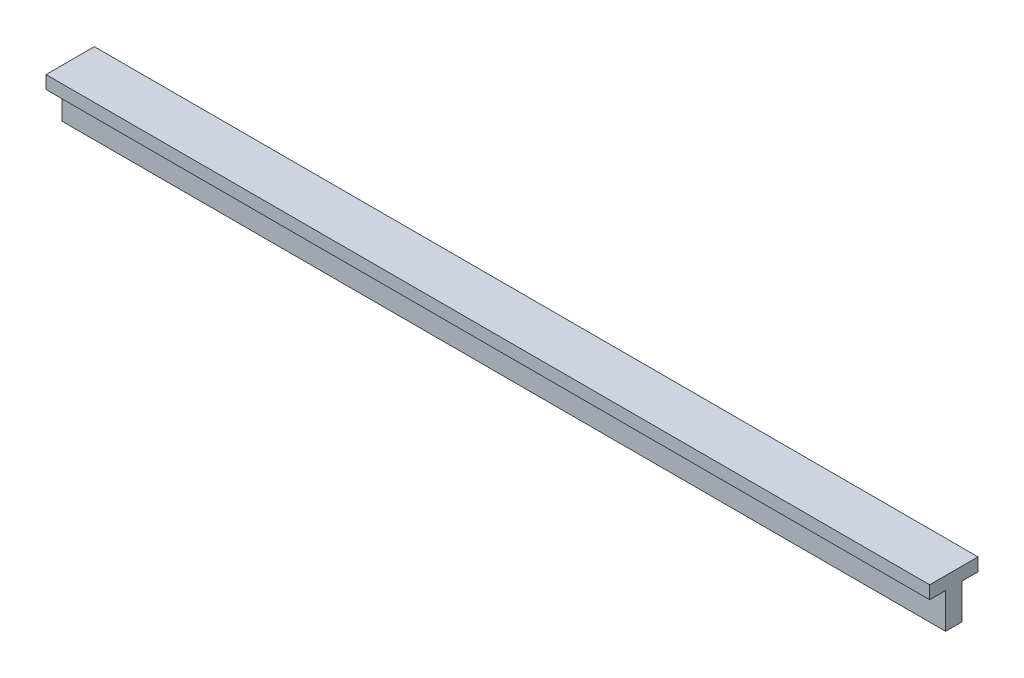
ISO-10303-21;
HEADER;
FILE_DESCRIPTION(('STEP AP214'),'2;1');
FILE_NAME('part.step','',(''),(''),'','','');
FILE_SCHEMA(('AUTOMOTIVE_DESIGN { 1 0 10303 214 1 1 1 1 }'));
ENDSEC;
DATA;
#1=APPLICATION_CONTEXT('core data for automotive mechanical design processes');
#2=APPLICATION_PROTOCOL_DEFINITION('international standard','automotive_design',2000,#1);
#3=PRODUCT_CONTEXT('',#1,'mechanical');
#4=PRODUCT('Part','Part','',(#3));
#5=PRODUCT_RELATED_PRODUCT_CATEGORY('part','',(#4));
#6=PRODUCT_DEFINITION_FORMATION('','',#4);
#7=PRODUCT_DEFINITION_CONTEXT('part definition',#1,'design');
#8=PRODUCT_DEFINITION('design','',#6,#7);
#9=PRODUCT_DEFINITION_SHAPE('','',#8);
#10=(LENGTH_UNIT() NAMED_UNIT(*) SI_UNIT(.MILLI.,.METRE.));
#11=(NAMED_UNIT(*) PLANE_ANGLE_UNIT() SI_UNIT($,.RADIAN.));
#12=(NAMED_UNIT(*) SI_UNIT($,.STERADIAN.) SOLID_ANGLE_UNIT());
#13=UNCERTAINTY_MEASURE_WITH_UNIT(LENGTH_MEASURE(1.E-05),#10,'distance_accuracy_value','');
#14=(GEOMETRIC_REPRESENTATION_CONTEXT(3) GLOBAL_UNCERTAINTY_ASSIGNED_CONTEXT((#13)) GLOBAL_UNIT_ASSIGNED_CONTEXT((#10,
#11,#12)) REPRESENTATION_CONTEXT('',''));
#15=CARTESIAN_POINT('',(0.,0.,0.));
#16=DIRECTION('',(0.,0.,1.));
#17=DIRECTION('',(1.,0.,0.));
#18=AXIS2_PLACEMENT_3D('',#15,#16,#17);
#19=CARTESIAN_POINT('',(1500.,-22.,-55.));
#20=DIRECTION('',(0.,0.,-1.));
#21=DIRECTION('',(0.,1.,0.));
#22=AXIS2_PLACEMENT_3D('',#19,#20,#21);
#23=PLANE('',#22);
#24=DIRECTION('',(0.,-1.,0.));
#25=VECTOR('',#24,1.);
#26=CARTESIAN_POINT('',(0.,-22.,-55.));
#27=LINE('',#26,#25);
#28=CARTESIAN_POINT('',(0.,-22.,-55.));
#29=VERTEX_POINT('',#28);
#30=CARTESIAN_POINT('',(0.,-82.,-55.));
#31=VERTEX_POINT('',#30);
#32=EDGE_CURVE('E134',#29,#31,#27,.T.);
#33=ORIENTED_EDGE('',*,*,#32,.F.);
#34=DIRECTION('',(-1.,0.,0.));
#35=VECTOR('',#34,1.);
#36=CARTESIAN_POINT('',(1500.,-22.,-55.));
#37=LINE('',#36,#35);
#38=CARTESIAN_POINT('',(1500.,-22.,-55.));
#39=VERTEX_POINT('',#38);
#40=EDGE_CURVE('E11',#39,#29,#37,.T.);
#41=ORIENTED_EDGE('',*,*,#40,.F.);
#42=DIRECTION('',(0.,-1.,0.));
#43=VECTOR('',#42,1.);
#44=CARTESIAN_POINT('',(1500.,-22.,-55.));
#45=LINE('',#44,#43);
#46=CARTESIAN_POINT('',(1500.,-82.,-55.));
#47=VERTEX_POINT('',#46);
#48=EDGE_CURVE('E151',#39,#47,#45,.T.);
#49=ORIENTED_EDGE('',*,*,#48,.T.);
#50=DIRECTION('',(-1.,0.,0.));
#51=VECTOR('',#50,1.);
#52=CARTESIAN_POINT('',(1500.,-82.,-55.));
#53=LINE('',#52,#51);
#54=EDGE_CURVE('E40',#47,#31,#53,.T.);
#55=ORIENTED_EDGE('',*,*,#54,.T.);
#56=EDGE_LOOP('',(#33,#41,#49,#55));
#57=FACE_BOUND('',#56,.T.);
#58=ADVANCED_FACE('F37',(#57),#23,.T.);
#59=CARTESIAN_POINT('',(1500.,-22.,-55.));
#60=DIRECTION('',(0.,1.,0.));
#61=DIRECTION('',(0.,0.,1.));
#62=AXIS2_PLACEMENT_3D('',#59,#60,#61);
#63=PLANE('',#62);
#64=DIRECTION('',(0.,0.,-1.));
#65=VECTOR('',#64,1.);
#66=CARTESIAN_POINT('',(0.,-22.,-55.));
#67=LINE('',#66,#65);
#68=CARTESIAN_POINT('',(0.,-22.,-82.));
#69=VERTEX_POINT('',#68);
#70=EDGE_CURVE('E150',#29,#69,#67,.T.);
#71=ORIENTED_EDGE('',*,*,#70,.T.);
#72=DIRECTION('',(-1.,0.,0.));
#73=VECTOR('',#72,1.);
#74=CARTESIAN_POINT('',(1500.,-22.,-82.));
#75=LINE('',#74,#73);
#76=CARTESIAN_POINT('',(1500.,-22.,-82.));
#77=VERTEX_POINT('',#76);
#78=EDGE_CURVE('E46',#77,#69,#75,.T.);
#79=ORIENTED_EDGE('',*,*,#78,.F.);
#80=DIRECTION('',(0.,0.,-1.));
#81=VECTOR('',#80,1.);
#82=CARTESIAN_POINT('',(1500.,-22.,-55.));
#83=LINE('',#82,#81);
#84=EDGE_CURVE('E123',#39,#77,#83,.T.);
#85=ORIENTED_EDGE('',*,*,#84,.F.);
#86=ORIENTED_EDGE('',*,*,#40,.T.);
#87=EDGE_LOOP('',(#71,#79,#85,#86));
#88=FACE_BOUND('',#87,.T.);
#89=ADVANCED_FACE('F166',(#88),#63,.F.);
#90=CARTESIAN_POINT('',(1500.,0.,-82.));
#91=DIRECTION('',(0.,0.,-1.));
#92=DIRECTION('',(-1.,0.,0.));
#93=AXIS2_PLACEMENT_3D('',#90,#91,#92);
#94=PLANE('',#93);
#95=DIRECTION('',(0.,-1.,0.));
#96=VECTOR('',#95,1.);
#97=CARTESIAN_POINT('',(0.,0.,-82.));
#98=LINE('',#97,#96);
#99=CARTESIAN_POINT('',(0.,0.,-82.));
#100=VERTEX_POINT('',#99);
#101=EDGE_CURVE('E111',#100,#69,#98,.T.);
#102=ORIENTED_EDGE('',*,*,#101,.F.);
#103=DIRECTION('',(-1.,0.,0.));
#104=VECTOR('',#103,1.);
#105=CARTESIAN_POINT('',(1500.,0.,-82.));
#106=LINE('',#105,#104);
#107=CARTESIAN_POINT('',(1500.,0.,-82.));
#108=VERTEX_POINT('',#107);
#109=EDGE_CURVE('E106',#108,#100,#106,.T.);
#110=ORIENTED_EDGE('',*,*,#109,.F.);
#111=DIRECTION('',(0.,-1.,0.));
#112=VECTOR('',#111,1.);
#113=CARTESIAN_POINT('',(1500.,0.,-82.));
#114=LINE('',#113,#112);
#115=EDGE_CURVE('E109',#108,#77,#114,.T.);
#116=ORIENTED_EDGE('',*,*,#115,.T.);
#117=ORIENTED_EDGE('',*,*,#78,.T.);
#118=EDGE_LOOP('',(#102,#110,#116,#117));
#119=FACE_BOUND('',#118,.T.);
#120=ADVANCED_FACE('F108',(#119),#94,.T.);
#121=CARTESIAN_POINT('',(1500.,0.,0.));
#122=DIRECTION('',(0.,1.,0.));
#123=DIRECTION('',(0.,0.,1.));
#124=AXIS2_PLACEMENT_3D('',#121,#122,#123);
#125=PLANE('',#124);
#126=DIRECTION('',(0.,0.,-1.));
#127=VECTOR('',#126,1.);
#128=CARTESIAN_POINT('',(0.,0.,0.));
#129=LINE('',#128,#127);
#130=CARTESIAN_POINT('',(0.,0.,0.));
#131=VERTEX_POINT('',#130);
#132=EDGE_CURVE('E147',#131,#100,#129,.T.);
#133=ORIENTED_EDGE('',*,*,#132,.F.);
#134=DIRECTION('',(-1.,0.,0.));
#135=VECTOR('',#134,1.);
#136=CARTESIAN_POINT('',(1500.,0.,0.));
#137=LINE('',#136,#135);
#138=CARTESIAN_POINT('',(1500.,0.,0.));
#139=VERTEX_POINT('',#138);
#140=EDGE_CURVE('E116',#139,#131,#137,.T.);
#141=ORIENTED_EDGE('',*,*,#140,.F.);
#142=DIRECTION('',(0.,0.,-1.));
#143=VECTOR('',#142,1.);
#144=CARTESIAN_POINT('',(1500.,0.,0.));
#145=LINE('',#144,#143);
#146=EDGE_CURVE('E122',#139,#108,#145,.T.);
#147=ORIENTED_EDGE('',*,*,#146,.T.);
#148=ORIENTED_EDGE('',*,*,#109,.T.);
#149=EDGE_LOOP('',(#133,#141,#147,#148));
#150=FACE_BOUND('',#149,.T.);
#151=ADVANCED_FACE('F125',(#150),#125,.T.);
#152=CARTESIAN_POINT('',(1500.,0.,0.));
#153=DIRECTION('',(0.,0.,-1.));
#154=DIRECTION('',(-1.,0.,0.));
#155=AXIS2_PLACEMENT_3D('',#152,#153,#154);
#156=PLANE('',#155);
#157=DIRECTION('',(0.,-1.,0.));
#158=VECTOR('',#157,1.);
#159=CARTESIAN_POINT('',(0.,0.,0.));
#160=LINE('',#159,#158);
#161=CARTESIAN_POINT('',(0.,-22.,0.));
#162=VERTEX_POINT('',#161);
#163=EDGE_CURVE('E145',#131,#162,#160,.T.);
#164=ORIENTED_EDGE('',*,*,#163,.T.);
#165=DIRECTION('',(-1.,0.,0.));
#166=VECTOR('',#165,1.);
#167=CARTESIAN_POINT('',(1500.,-22.,0.));
#168=LINE('',#167,#166);
#169=CARTESIAN_POINT('',(1500.,-22.,0.));
#170=VERTEX_POINT('',#169);
#171=EDGE_CURVE('E155',#170,#162,#168,.T.);
#172=ORIENTED_EDGE('',*,*,#171,.F.);
#173=DIRECTION('',(0.,-1.,0.));
#174=VECTOR('',#173,1.);
#175=CARTESIAN_POINT('',(1500.,0.,0.));
#176=LINE('',#175,#174);
#177=EDGE_CURVE('E127',#139,#170,#176,.T.);
#178=ORIENTED_EDGE('',*,*,#177,.F.);
#179=ORIENTED_EDGE('',*,*,#140,.T.);
#180=EDGE_LOOP('',(#164,#172,#178,#179));
#181=FACE_BOUND('',#180,.T.);
#182=ADVANCED_FACE('F183',(#181),#156,.F.);
#183=CARTESIAN_POINT('',(1500.,-22.,0.));
#184=DIRECTION('',(0.,1.,0.));
#185=DIRECTION('',(0.,0.,1.));
#186=AXIS2_PLACEMENT_3D('',#183,#184,#185);
#187=PLANE('',#186);
#188=DIRECTION('',(0.,0.,-1.));
#189=VECTOR('',#188,1.);
#190=CARTESIAN_POINT('',(0.,-22.,0.));
#191=LINE('',#190,#189);
#192=CARTESIAN_POINT('',(0.,-22.,-27.));
#193=VERTEX_POINT('',#192);
#194=EDGE_CURVE('E143',#162,#193,#191,.T.);
#195=ORIENTED_EDGE('',*,*,#194,.T.);
#196=DIRECTION('',(-1.,0.,0.));
#197=VECTOR('',#196,1.);
#198=CARTESIAN_POINT('',(1500.,-22.,-27.));
#199=LINE('',#198,#197);
#200=CARTESIAN_POINT('',(1500.,-22.,-27.));
#201=VERTEX_POINT('',#200);
#202=EDGE_CURVE('E158',#201,#193,#199,.T.);
#203=ORIENTED_EDGE('',*,*,#202,.F.);
#204=DIRECTION('',(0.,0.,-1.));
#205=VECTOR('',#204,1.);
#206=CARTESIAN_POINT('',(1500.,-22.,0.));
#207=LINE('',#206,#205);
#208=EDGE_CURVE('E129',#170,#201,#207,.T.);
#209=ORIENTED_EDGE('',*,*,#208,.F.);
#210=ORIENTED_EDGE('',*,*,#171,.T.);
#211=EDGE_LOOP('',(#195,#203,#209,#210));
#212=FACE_BOUND('',#211,.T.);
#213=ADVANCED_FACE('F177',(#212),#187,.F.);
#214=CARTESIAN_POINT('',(1500.,-22.,-27.));
#215=DIRECTION('',(0.,0.,-1.));
#216=DIRECTION('',(0.,1.,0.));
#217=AXIS2_PLACEMENT_3D('',#214,#215,#216);
#218=PLANE('',#217);
#219=DIRECTION('',(0.,-1.,0.));
#220=VECTOR('',#219,1.);
#221=CARTESIAN_POINT('',(0.,-22.,-27.));
#222=LINE('',#221,#220);
#223=CARTESIAN_POINT('',(0.,-82.,-27.));
#224=VERTEX_POINT('',#223);
#225=EDGE_CURVE('E140',#193,#224,#222,.T.);
#226=ORIENTED_EDGE('',*,*,#225,.T.);
#227=DIRECTION('',(-1.,0.,0.));
#228=VECTOR('',#227,1.);
#229=CARTESIAN_POINT('',(1500.,-82.,-27.));
#230=LINE('',#229,#228);
#231=CARTESIAN_POINT('',(1500.,-82.,-27.));
#232=VERTEX_POINT('',#231);
#233=EDGE_CURVE('E160',#232,#224,#230,.T.);
#234=ORIENTED_EDGE('',*,*,#233,.F.);
#235=DIRECTION('',(0.,-1.,0.));
#236=VECTOR('',#235,1.);
#237=CARTESIAN_POINT('',(1500.,-22.,-27.));
#238=LINE('',#237,#236);
#239=EDGE_CURVE('E169',#201,#232,#238,.T.);
#240=ORIENTED_EDGE('',*,*,#239,.F.);
#241=ORIENTED_EDGE('',*,*,#202,.T.);
#242=EDGE_LOOP('',(#226,#234,#240,#241));
#243=FACE_BOUND('',#242,.T.);
#244=ADVANCED_FACE('F180',(#243),#218,.F.);
#245=CARTESIAN_POINT('',(1500.,-82.,-55.));
#246=DIRECTION('',(0.,-1.,0.));
#247=DIRECTION('',(0.,0.,-1.));
#248=AXIS2_PLACEMENT_3D('',#245,#246,#247);
#249=PLANE('',#248);
#250=DIRECTION('',(0.,0.,1.));
#251=VECTOR('',#250,1.);
#252=CARTESIAN_POINT('',(0.,-82.,-55.));
#253=LINE('',#252,#251);
#254=EDGE_CURVE('E137',#31,#224,#253,.T.);
#255=ORIENTED_EDGE('',*,*,#254,.F.);
#256=ORIENTED_EDGE('',*,*,#54,.F.);
#257=DIRECTION('',(0.,0.,1.));
#258=VECTOR('',#257,1.);
#259=CARTESIAN_POINT('',(1500.,-82.,-55.));
#260=LINE('',#259,#258);
#261=EDGE_CURVE('E167',#47,#232,#260,.T.);
#262=ORIENTED_EDGE('',*,*,#261,.T.);
#263=ORIENTED_EDGE('',*,*,#233,.T.);
#264=EDGE_LOOP('',(#255,#256,#262,#263));
#265=FACE_BOUND('',#264,.T.);
#266=ADVANCED_FACE('F162',(#265),#249,.T.);
#267=CARTESIAN_POINT('',(1500.,0.,0.));
#268=DIRECTION('',(-1.,0.,0.));
#269=DIRECTION('',(0.,0.,1.));
#270=AXIS2_PLACEMENT_3D('',#267,#268,#269);
#271=PLANE('',#270);
#272=ORIENTED_EDGE('',*,*,#48,.F.);
#273=ORIENTED_EDGE('',*,*,#84,.T.);
#274=ORIENTED_EDGE('',*,*,#115,.F.);
#275=ORIENTED_EDGE('',*,*,#146,.F.);
#276=ORIENTED_EDGE('',*,*,#177,.T.);
#277=ORIENTED_EDGE('',*,*,#208,.T.);
#278=ORIENTED_EDGE('',*,*,#239,.T.);
#279=ORIENTED_EDGE('',*,*,#261,.F.);
#280=EDGE_LOOP('',(#272,#273,#274,#275,#276,#277,#278,#279));
#281=FACE_BOUND('',#280,.T.);
#282=ADVANCED_FACE('F121',(#281),#271,.F.);
#283=CARTESIAN_POINT('',(0.,0.,0.));
#284=DIRECTION('',(-1.,0.,0.));
#285=DIRECTION('',(0.,0.,1.));
#286=AXIS2_PLACEMENT_3D('',#283,#284,#285);
#287=PLANE('',#286);
#288=ORIENTED_EDGE('',*,*,#32,.T.);
#289=ORIENTED_EDGE('',*,*,#254,.T.);
#290=ORIENTED_EDGE('',*,*,#225,.F.);
#291=ORIENTED_EDGE('',*,*,#194,.F.);
#292=ORIENTED_EDGE('',*,*,#163,.F.);
#293=ORIENTED_EDGE('',*,*,#132,.T.);
#294=ORIENTED_EDGE('',*,*,#101,.T.);
#295=ORIENTED_EDGE('',*,*,#70,.F.);
#296=EDGE_LOOP('',(#288,#289,#290,#291,#292,#293,#294,#295));
#297=FACE_BOUND('',#296,.T.);
#298=ADVANCED_FACE('F165',(#297),#287,.T.);
#299=CLOSED_SHELL('',(#58,#89,#120,#151,#182,#213,#244,#266,#282,#298));
#300=MANIFOLD_SOLID_BREP('B2',#299);
#301=ADVANCED_BREP_SHAPE_REPRESENTATION('',(#18,#300),#14);
#302=SHAPE_DEFINITION_REPRESENTATION(#9,#301);
ENDSEC;
END-ISO-10303-21;
